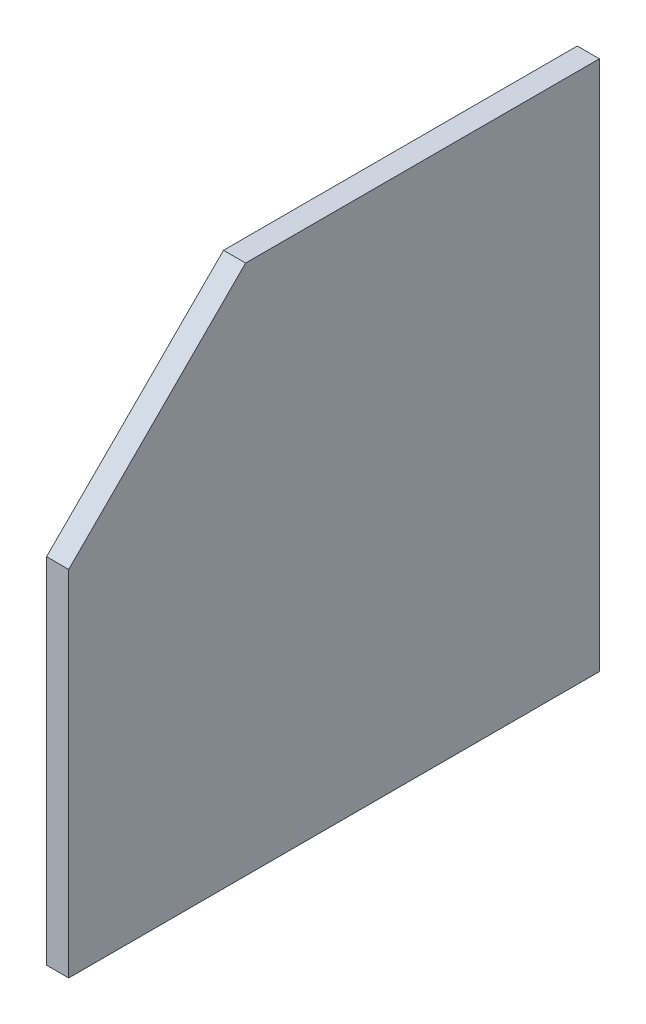
ISO-10303-21;
HEADER;
FILE_DESCRIPTION(('STEP AP214'),'2;1');
FILE_NAME('part.step','',(''),(''),'','','');
FILE_SCHEMA(('AUTOMOTIVE_DESIGN { 1 0 10303 214 1 1 1 1 }'));
ENDSEC;
DATA;
#1=APPLICATION_CONTEXT('core data for automotive mechanical design processes');
#2=APPLICATION_PROTOCOL_DEFINITION('international standard','automotive_design',2000,#1);
#3=PRODUCT_CONTEXT('',#1,'mechanical');
#4=PRODUCT('Part','Part','',(#3));
#5=PRODUCT_RELATED_PRODUCT_CATEGORY('part','',(#4));
#6=PRODUCT_DEFINITION_FORMATION('','',#4);
#7=PRODUCT_DEFINITION_CONTEXT('part definition',#1,'design');
#8=PRODUCT_DEFINITION('design','',#6,#7);
#9=PRODUCT_DEFINITION_SHAPE('','',#8);
#10=(LENGTH_UNIT() NAMED_UNIT(*) SI_UNIT(.MILLI.,.METRE.));
#11=(NAMED_UNIT(*) PLANE_ANGLE_UNIT() SI_UNIT($,.RADIAN.));
#12=(NAMED_UNIT(*) SI_UNIT($,.STERADIAN.) SOLID_ANGLE_UNIT());
#13=UNCERTAINTY_MEASURE_WITH_UNIT(LENGTH_MEASURE(1.E-05),#10,'distance_accuracy_value','');
#14=(GEOMETRIC_REPRESENTATION_CONTEXT(3) GLOBAL_UNCERTAINTY_ASSIGNED_CONTEXT((#13)) GLOBAL_UNIT_ASSIGNED_CONTEXT((#10,
#11,#12)) REPRESENTATION_CONTEXT('',''));
#15=CARTESIAN_POINT('',(0.,0.,0.));
#16=DIRECTION('',(0.,0.,1.));
#17=DIRECTION('',(1.,0.,0.));
#18=AXIS2_PLACEMENT_3D('',#15,#16,#17);
#19=CARTESIAN_POINT('',(3.175,-38.1,-38.1));
#20=DIRECTION('',(0.,0.,1.));
#21=DIRECTION('',(1.,0.,0.));
#22=AXIS2_PLACEMENT_3D('',#19,#20,#21);
#23=PLANE('',#22);
#24=DIRECTION('',(0.,1.,0.));
#25=VECTOR('',#24,1.);
#26=CARTESIAN_POINT('',(0.,-38.1,-38.1));
#27=LINE('',#26,#25);
#28=CARTESIAN_POINT('',(0.,-38.1,-38.1));
#29=VERTEX_POINT('',#28);
#30=CARTESIAN_POINT('',(0.,38.1,-38.1));
#31=VERTEX_POINT('',#30);
#32=EDGE_CURVE('E113',#29,#31,#27,.T.);
#33=ORIENTED_EDGE('',*,*,#32,.T.);
#34=DIRECTION('',(-1.,0.,0.));
#35=VECTOR('',#34,1.);
#36=CARTESIAN_POINT('',(3.175,38.1,-38.1));
#37=LINE('',#36,#35);
#38=CARTESIAN_POINT('',(3.175,38.1,-38.1));
#39=VERTEX_POINT('',#38);
#40=EDGE_CURVE('E11',#39,#31,#37,.T.);
#41=ORIENTED_EDGE('',*,*,#40,.F.);
#42=DIRECTION('',(0.,1.,0.));
#43=VECTOR('',#42,1.);
#44=CARTESIAN_POINT('',(3.175,-38.1,-38.1));
#45=LINE('',#44,#43);
#46=CARTESIAN_POINT('',(3.175,-38.1,-38.1));
#47=VERTEX_POINT('',#46);
#48=EDGE_CURVE('E121',#47,#39,#45,.T.);
#49=ORIENTED_EDGE('',*,*,#48,.F.);
#50=DIRECTION('',(-1.,0.,0.));
#51=VECTOR('',#50,1.);
#52=CARTESIAN_POINT('',(3.175,-38.1,-38.1));
#53=LINE('',#52,#51);
#54=EDGE_CURVE('E109',#47,#29,#53,.T.);
#55=ORIENTED_EDGE('',*,*,#54,.T.);
#56=EDGE_LOOP('',(#33,#41,#49,#55));
#57=FACE_BOUND('',#56,.T.);
#58=ADVANCED_FACE('F39',(#57),#23,.F.);
#59=CARTESIAN_POINT('',(3.175,38.1,-38.1));
#60=DIRECTION('',(0.,-1.,0.));
#61=DIRECTION('',(0.,0.,-1.));
#62=AXIS2_PLACEMENT_3D('',#59,#60,#61);
#63=PLANE('',#62);
#64=DIRECTION('',(0.,0.,1.));
#65=VECTOR('',#64,1.);
#66=CARTESIAN_POINT('',(0.,38.1,-38.1));
#67=LINE('',#66,#65);
#68=CARTESIAN_POINT('',(0.,38.1,12.7));
#69=VERTEX_POINT('',#68);
#70=EDGE_CURVE('E116',#31,#69,#67,.T.);
#71=ORIENTED_EDGE('',*,*,#70,.T.);
#72=DIRECTION('',(-1.,0.,0.));
#73=VECTOR('',#72,1.);
#74=CARTESIAN_POINT('',(3.175,38.1,12.7));
#75=LINE('',#74,#73);
#76=CARTESIAN_POINT('',(3.175,38.1,12.7));
#77=VERTEX_POINT('',#76);
#78=EDGE_CURVE('E47',#77,#69,#75,.T.);
#79=ORIENTED_EDGE('',*,*,#78,.F.);
#80=DIRECTION('',(0.,0.,1.));
#81=VECTOR('',#80,1.);
#82=CARTESIAN_POINT('',(3.175,38.1,-38.1));
#83=LINE('',#82,#81);
#84=EDGE_CURVE('E89',#39,#77,#83,.T.);
#85=ORIENTED_EDGE('',*,*,#84,.F.);
#86=ORIENTED_EDGE('',*,*,#40,.T.);
#87=EDGE_LOOP('',(#71,#79,#85,#86));
#88=FACE_BOUND('',#87,.T.);
#89=ADVANCED_FACE('F140',(#88),#63,.F.);
#90=CARTESIAN_POINT('',(3.175,38.1,12.7));
#91=DIRECTION('',(0.,-0.707106781186548,-0.707106781186547));
#92=DIRECTION('',(0.,0.707106781186547,-0.707106781186548));
#93=AXIS2_PLACEMENT_3D('',#90,#91,#92);
#94=PLANE('',#93);
#95=DIRECTION('',(0.,-0.707106781186547,0.707106781186548));
#96=VECTOR('',#95,1.);
#97=CARTESIAN_POINT('',(0.,38.1,12.7));
#98=LINE('',#97,#96);
#99=CARTESIAN_POINT('',(0.,12.7,38.1));
#100=VERTEX_POINT('',#99);
#101=EDGE_CURVE('E104',#69,#100,#98,.T.);
#102=ORIENTED_EDGE('',*,*,#101,.T.);
#103=DIRECTION('',(-1.,0.,0.));
#104=VECTOR('',#103,1.);
#105=CARTESIAN_POINT('',(3.175,12.7,38.1));
#106=LINE('',#105,#104);
#107=CARTESIAN_POINT('',(3.175,12.7,38.1));
#108=VERTEX_POINT('',#107);
#109=EDGE_CURVE('E101',#108,#100,#106,.T.);
#110=ORIENTED_EDGE('',*,*,#109,.F.);
#111=DIRECTION('',(0.,-0.707106781186547,0.707106781186548));
#112=VECTOR('',#111,1.);
#113=CARTESIAN_POINT('',(3.175,38.1,12.7));
#114=LINE('',#113,#112);
#115=EDGE_CURVE('E93',#77,#108,#114,.T.);
#116=ORIENTED_EDGE('',*,*,#115,.F.);
#117=ORIENTED_EDGE('',*,*,#78,.T.);
#118=EDGE_LOOP('',(#102,#110,#116,#117));
#119=FACE_BOUND('',#118,.T.);
#120=ADVANCED_FACE('F102',(#119),#94,.F.);
#121=CARTESIAN_POINT('',(3.175,12.7,38.1));
#122=DIRECTION('',(0.,0.,-1.));
#123=DIRECTION('',(0.,1.,0.));
#124=AXIS2_PLACEMENT_3D('',#121,#122,#123);
#125=PLANE('',#124);
#126=DIRECTION('',(0.,-1.,0.));
#127=VECTOR('',#126,1.);
#128=CARTESIAN_POINT('',(0.,12.7,38.1));
#129=LINE('',#128,#127);
#130=CARTESIAN_POINT('',(0.,-38.1,38.1));
#131=VERTEX_POINT('',#130);
#132=EDGE_CURVE('E75',#100,#131,#129,.T.);
#133=ORIENTED_EDGE('',*,*,#132,.T.);
#134=DIRECTION('',(-1.,0.,0.));
#135=VECTOR('',#134,1.);
#136=CARTESIAN_POINT('',(3.175,-38.1,38.1));
#137=LINE('',#136,#135);
#138=CARTESIAN_POINT('',(3.175,-38.1,38.1));
#139=VERTEX_POINT('',#138);
#140=EDGE_CURVE('E105',#139,#131,#137,.T.);
#141=ORIENTED_EDGE('',*,*,#140,.F.);
#142=DIRECTION('',(0.,-1.,0.));
#143=VECTOR('',#142,1.);
#144=CARTESIAN_POINT('',(3.175,12.7,38.1));
#145=LINE('',#144,#143);
#146=EDGE_CURVE('E97',#108,#139,#145,.T.);
#147=ORIENTED_EDGE('',*,*,#146,.F.);
#148=ORIENTED_EDGE('',*,*,#109,.T.);
#149=EDGE_LOOP('',(#133,#141,#147,#148));
#150=FACE_BOUND('',#149,.T.);
#151=ADVANCED_FACE('F107',(#150),#125,.F.);
#152=CARTESIAN_POINT('',(3.175,-38.1,-38.1));
#153=DIRECTION('',(0.,1.,0.));
#154=DIRECTION('',(0.,0.,1.));
#155=AXIS2_PLACEMENT_3D('',#152,#153,#154);
#156=PLANE('',#155);
#157=DIRECTION('',(0.,0.,-1.));
#158=VECTOR('',#157,1.);
#159=CARTESIAN_POINT('',(0.,-38.1,-38.1));
#160=LINE('',#159,#158);
#161=EDGE_CURVE('E81',#131,#29,#160,.T.);
#162=ORIENTED_EDGE('',*,*,#161,.T.);
#163=ORIENTED_EDGE('',*,*,#54,.F.);
#164=DIRECTION('',(0.,0.,-1.));
#165=VECTOR('',#164,1.);
#166=CARTESIAN_POINT('',(3.175,-38.1,-38.1));
#167=LINE('',#166,#165);
#168=EDGE_CURVE('E55',#139,#47,#167,.T.);
#169=ORIENTED_EDGE('',*,*,#168,.F.);
#170=ORIENTED_EDGE('',*,*,#140,.T.);
#171=EDGE_LOOP('',(#162,#163,#169,#170));
#172=FACE_BOUND('',#171,.T.);
#173=ADVANCED_FACE('F129',(#172),#156,.F.);
#174=CARTESIAN_POINT('',(3.175,0.,0.));
#175=DIRECTION('',(1.,0.,0.));
#176=DIRECTION('',(0.,0.,-1.));
#177=AXIS2_PLACEMENT_3D('',#174,#175,#176);
#178=PLANE('',#177);
#179=ORIENTED_EDGE('',*,*,#48,.T.);
#180=ORIENTED_EDGE('',*,*,#84,.T.);
#181=ORIENTED_EDGE('',*,*,#115,.T.);
#182=ORIENTED_EDGE('',*,*,#146,.T.);
#183=ORIENTED_EDGE('',*,*,#168,.T.);
#184=EDGE_LOOP('',(#179,#180,#181,#182,#183));
#185=FACE_BOUND('',#184,.T.);
#186=ADVANCED_FACE('F95',(#185),#178,.T.);
#187=CARTESIAN_POINT('',(0.,0.,0.));
#188=DIRECTION('',(1.,0.,0.));
#189=DIRECTION('',(0.,0.,-1.));
#190=AXIS2_PLACEMENT_3D('',#187,#188,#189);
#191=PLANE('',#190);
#192=ORIENTED_EDGE('',*,*,#32,.F.);
#193=ORIENTED_EDGE('',*,*,#161,.F.);
#194=ORIENTED_EDGE('',*,*,#132,.F.);
#195=ORIENTED_EDGE('',*,*,#101,.F.);
#196=ORIENTED_EDGE('',*,*,#70,.F.);
#197=EDGE_LOOP('',(#192,#193,#194,#195,#196));
#198=FACE_BOUND('',#197,.T.);
#199=ADVANCED_FACE('F125',(#198),#191,.F.);
#200=CLOSED_SHELL('',(#58,#89,#120,#151,#173,#186,#199));
#201=MANIFOLD_SOLID_BREP('B2',#200);
#202=ADVANCED_BREP_SHAPE_REPRESENTATION('',(#18,#201),#14);
#203=SHAPE_DEFINITION_REPRESENTATION(#9,#202);
ENDSEC;
END-ISO-10303-21;
